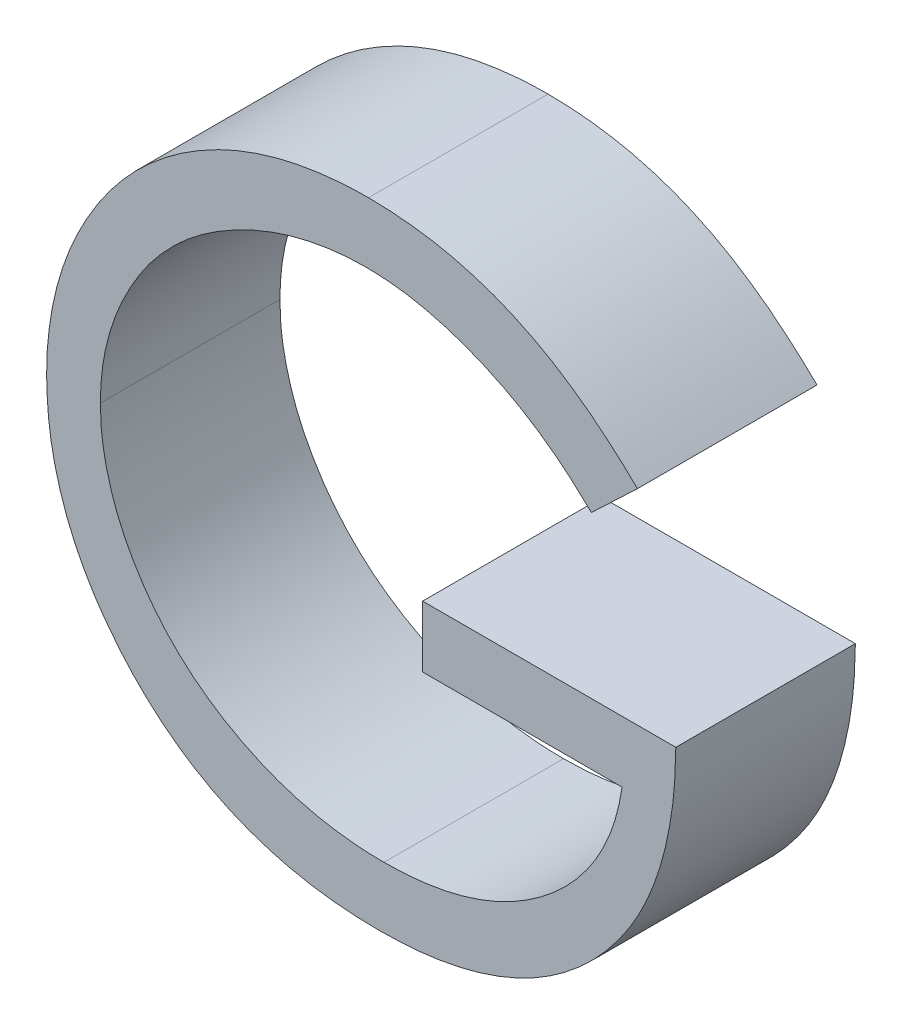
ISO-10303-21;
HEADER;
FILE_DESCRIPTION(('STEP AP214'),'2;1');
FILE_NAME('part.step','',(''),(''),'','','');
FILE_SCHEMA(('AUTOMOTIVE_DESIGN { 1 0 10303 214 1 1 1 1 }'));
ENDSEC;
DATA;
#1=APPLICATION_CONTEXT('core data for automotive mechanical design processes');
#2=APPLICATION_PROTOCOL_DEFINITION('international standard','automotive_design',2000,#1);
#3=PRODUCT_CONTEXT('',#1,'mechanical');
#4=PRODUCT('Part','Part','',(#3));
#5=PRODUCT_RELATED_PRODUCT_CATEGORY('part','',(#4));
#6=PRODUCT_DEFINITION_FORMATION('','',#4);
#7=PRODUCT_DEFINITION_CONTEXT('part definition',#1,'design');
#8=PRODUCT_DEFINITION('design','',#6,#7);
#9=PRODUCT_DEFINITION_SHAPE('','',#8);
#10=(LENGTH_UNIT() NAMED_UNIT(*) SI_UNIT(.MILLI.,.METRE.));
#11=(NAMED_UNIT(*) PLANE_ANGLE_UNIT() SI_UNIT($,.RADIAN.));
#12=(NAMED_UNIT(*) SI_UNIT($,.STERADIAN.) SOLID_ANGLE_UNIT());
#13=UNCERTAINTY_MEASURE_WITH_UNIT(LENGTH_MEASURE(1.E-05),#10,'distance_accuracy_value','');
#14=(GEOMETRIC_REPRESENTATION_CONTEXT(3) GLOBAL_UNCERTAINTY_ASSIGNED_CONTEXT((#13)) GLOBAL_UNIT_ASSIGNED_CONTEXT((#10,
#11,#12)) REPRESENTATION_CONTEXT('',''));
#15=CARTESIAN_POINT('',(0.,0.,0.));
#16=DIRECTION('',(0.,0.,1.));
#17=DIRECTION('',(1.,0.,0.));
#18=AXIS2_PLACEMENT_3D('',#15,#16,#17);
#19=CARTESIAN_POINT('',(-52.9995726976644,-17.7419139480257,1.5));
#20=CARTESIAN_POINT('',(-52.947803778146,-17.7427417933741,1.5));
#21=CARTESIAN_POINT('',(-52.8451520942351,-17.7443833134178,1.5));
#22=CARTESIAN_POINT('',(-52.692401048078,-17.7557613820899,1.5));
#23=CARTESIAN_POINT('',(-52.5420110271574,-17.7737954979667,1.5));
#24=CARTESIAN_POINT('',(-52.3937590416175,-17.7984051931004,1.5));
#25=CARTESIAN_POINT('',(-52.2481499470088,-17.8319247509659,1.5));
#26=CARTESIAN_POINT('',(-52.1047689392605,-17.8720365861798,1.5));
#27=CARTESIAN_POINT('',(-51.9634081731927,-17.9187391898525,1.5));
#28=CARTESIAN_POINT('',(-51.8245106743858,-17.9744375417672,1.5));
#29=CARTESIAN_POINT('',(-51.6871425086269,-18.0376570059468,1.5));
#30=CARTESIAN_POINT('',(-51.5505398793788,-18.1088190379541,1.5));
#31=CARTESIAN_POINT('',(-51.4151695279825,-18.1891404731405,1.5));
#32=CARTESIAN_POINT('',(-51.2807966973733,-18.2788598096078,1.5));
#33=CARTESIAN_POINT('',(-51.1465740432077,-18.376436120826,1.5));
#34=CARTESIAN_POINT('',(-51.0146245541307,-18.4846601546064,1.5));
#35=CARTESIAN_POINT('',(-50.8817632052066,-18.5992640915342,1.5));
#36=CARTESIAN_POINT('',(-50.7963320420432,-18.6816672113976,1.5));
#37=CARTESIAN_POINT('',(-50.7529781463824,-18.7234844608462,1.5));
#38=B_SPLINE_CURVE_WITH_KNOTS('',3,(#19,#20,#21,#22,#23,#24,#25,#26,#27,#28,#29,#30,#31,#32,#33,
#34,#35,#36,#37),.UNSPECIFIED.,.F.,.F.,(4,1,1,1,1,1,1,1,1,1,1,1,1,1,1,1,4),(0.,
0.0616169448204958,0.122179160819154,0.182216270448317,0.241864128661119,0.300960055602617,
0.35996906787339,0.419032918137867,0.478068687013021,0.537992581073218,0.598960230329196,
0.661321078882261,0.725247568886691,0.791220154152247,0.858745971844813,0.928317581412213,1.),.UNSPECIFIED.);
#39=DIRECTION('',(0.,0.,-1.));
#40=VECTOR('',#39,1.);
#41=SURFACE_OF_LINEAR_EXTRUSION('',#38,#40);
#42=CARTESIAN_POINT('',(-52.9995726976644,-17.7419139480257,0.));
#43=CARTESIAN_POINT('',(-52.947803778146,-17.7427417933741,0.));
#44=CARTESIAN_POINT('',(-52.8451520942351,-17.7443833134178,0.));
#45=CARTESIAN_POINT('',(-52.692401048078,-17.7557613820899,0.));
#46=CARTESIAN_POINT('',(-52.5420110271574,-17.7737954979667,0.));
#47=CARTESIAN_POINT('',(-52.3937590416175,-17.7984051931004,0.));
#48=CARTESIAN_POINT('',(-52.2481499470088,-17.8319247509659,0.));
#49=CARTESIAN_POINT('',(-52.1047689392605,-17.8720365861798,0.));
#50=CARTESIAN_POINT('',(-51.9634081731927,-17.9187391898525,0.));
#51=CARTESIAN_POINT('',(-51.8245106743858,-17.9744375417672,0.));
#52=CARTESIAN_POINT('',(-51.6871425086269,-18.0376570059468,0.));
#53=CARTESIAN_POINT('',(-51.5505398793788,-18.1088190379541,0.));
#54=CARTESIAN_POINT('',(-51.4151695279825,-18.1891404731405,0.));
#55=CARTESIAN_POINT('',(-51.2807966973733,-18.2788598096078,0.));
#56=CARTESIAN_POINT('',(-51.1465740432077,-18.376436120826,0.));
#57=CARTESIAN_POINT('',(-51.0146245541307,-18.4846601546064,0.));
#58=CARTESIAN_POINT('',(-50.8817632052066,-18.5992640915342,0.));
#59=CARTESIAN_POINT('',(-50.7963320420432,-18.6816672113976,0.));
#60=CARTESIAN_POINT('',(-50.7529781463824,-18.7234844608462,0.));
#61=B_SPLINE_CURVE_WITH_KNOTS('',3,(#42,#43,#44,#45,#46,#47,#48,#49,#50,#51,#52,#53,#54,#55,#56,
#57,#58,#59,#60),.UNSPECIFIED.,.F.,.F.,(4,1,1,1,1,1,1,1,1,1,1,1,1,1,1,1,4),(0.,
0.0616169448204958,0.122179160819154,0.182216270448317,0.241864128661119,0.300960055602617,
0.35996906787339,0.419032918137867,0.478068687013021,0.537992581073218,0.598960230329196,
0.661321078882261,0.725247568886691,0.791220154152247,0.858745971844813,0.928317581412213,1.),.UNSPECIFIED.);
#62=CARTESIAN_POINT('',(-52.9995726976644,-17.7419139480257,0.));
#63=VERTEX_POINT('',#62);
#64=CARTESIAN_POINT('',(-50.7529781463824,-18.7234844608462,0.));
#65=VERTEX_POINT('',#64);
#66=EDGE_CURVE('E251',#63,#65,#61,.T.);
#67=ORIENTED_EDGE('',*,*,#66,.F.);
#68=DIRECTION('',(0.,0.,-1.));
#69=VECTOR('',#68,1.);
#70=CARTESIAN_POINT('',(-52.9995726976644,-17.7419139480257,1.5));
#71=LINE('',#70,#69);
#72=CARTESIAN_POINT('',(-52.9995726976644,-17.7419139480257,1.5));
#73=VERTEX_POINT('',#72);
#74=EDGE_CURVE('E11',#73,#63,#71,.T.);
#75=ORIENTED_EDGE('',*,*,#74,.F.);
#76=CARTESIAN_POINT('',(-50.7529781463824,-18.7234844608462,1.5));
#77=VERTEX_POINT('',#76);
#78=EDGE_CURVE('E279',#73,#77,#38,.T.);
#79=ORIENTED_EDGE('',*,*,#78,.T.);
#80=DIRECTION('',(0.,0.,-1.));
#81=VECTOR('',#80,1.);
#82=CARTESIAN_POINT('',(-50.7529781463824,-18.7234844608462,1.5));
#83=LINE('',#82,#81);
#84=EDGE_CURVE('E37',#77,#65,#83,.T.);
#85=ORIENTED_EDGE('',*,*,#84,.T.);
#86=EDGE_LOOP('',(#67,#75,#79,#85));
#87=FACE_BOUND('',#86,.T.);
#88=ADVANCED_FACE('F33',(#87),#41,.T.);
#89=CARTESIAN_POINT('',(-55.6888755822798,-20.3681158711026,1.5));
#90=CARTESIAN_POINT('',(-55.6881152420844,-20.3093069386906,1.5));
#91=CARTESIAN_POINT('',(-55.6866042251531,-20.1924364994753,1.5));
#92=CARTESIAN_POINT('',(-55.6682820591942,-20.0189260602507,1.5));
#93=CARTESIAN_POINT('',(-55.6419943192026,-19.8484965000175,1.5));
#94=CARTESIAN_POINT('',(-55.6033556697908,-19.6812871339121,1.5));
#95=CARTESIAN_POINT('',(-55.5546467201972,-19.5171862885382,1.5));
#96=CARTESIAN_POINT('',(-55.4938560258866,-19.3561177687274,1.5));
#97=CARTESIAN_POINT('',(-55.423077603092,-19.1979865235677,1.5));
#98=CARTESIAN_POINT('',(-55.3408126085724,-19.0438809978618,1.5));
#99=CARTESIAN_POINT('',(-55.249263380756,-18.8958461224563,1.5));
#100=CARTESIAN_POINT('',(-55.1499059231459,-18.7544778319306,1.5));
#101=CARTESIAN_POINT('',(-55.0413293513807,-18.6223505962421,1.5));
#102=CARTESIAN_POINT('',(-54.9253067806239,-18.4977910987295,1.5));
#103=CARTESIAN_POINT('',(-54.8004539374581,-18.3823641744638,1.5));
#104=CARTESIAN_POINT('',(-54.6679404750759,-18.275001159205,1.5));
#105=CARTESIAN_POINT('',(-54.5276642709644,-18.1755580366291,1.5));
#106=CARTESIAN_POINT('',(-54.379184013834,-18.0856011298524,1.5));
#107=CARTESIAN_POINT('',(-54.2247158932105,-18.0047959577563,1.5));
#108=CARTESIAN_POINT('',(-54.064630176858,-17.9339542267268,1.5));
#109=CARTESIAN_POINT('',(-53.8989757327054,-17.875406633204,1.5));
#110=CARTESIAN_POINT('',(-53.7289936218054,-17.8257298051632,1.5));
#111=CARTESIAN_POINT('',(-53.5533971923139,-17.7889938900327,1.5));
#112=CARTESIAN_POINT('',(-53.3734607110586,-17.7623528251969,1.5));
#113=CARTESIAN_POINT('',(-53.1882462653195,-17.7441233971108,1.5));
#114=CARTESIAN_POINT('',(-53.0630519377104,-17.7426573173836,1.5));
#115=CARTESIAN_POINT('',(-52.9995726976644,-17.7419139480257,1.5));
#116=B_SPLINE_CURVE_WITH_KNOTS('',3,(#89,#90,#91,#92,#93,#94,#95,#96,#97,#98,#99,#100,#101,#102,
#103,#104,#105,#106,#107,#108,#109,#110,#111,#112,#113,#114,#115),.UNSPECIFIED.,.F.,.F.,(4,1,1,
1,1,1,1,1,1,1,1,1,1,1,1,1,1,1,1,1,1,1,1,1,4),(0.,0.042039379701216,0.083544464565361,
0.124643056673449,0.165303063451956,0.206170747136531,0.246970719928893,0.288329266023863,
0.329986532825205,0.371797472895551,0.412737629424681,0.453459280518726,0.494001342419668,
0.534380667601164,0.574951545297472,0.615891701826603,0.657249558721596,0.69900660682437,
0.740486273750268,0.782325155707546,0.824567455462729,0.867041243730895,0.910499531482223,
0.954619176173828,1.),.UNSPECIFIED.);
#117=DIRECTION('',(0.,0.,-1.));
#118=VECTOR('',#117,1.);
#119=SURFACE_OF_LINEAR_EXTRUSION('',#116,#118);
#120=CARTESIAN_POINT('',(-55.6888755822798,-20.3681158711026,0.));
#121=CARTESIAN_POINT('',(-55.6881152420844,-20.3093069386906,0.));
#122=CARTESIAN_POINT('',(-55.6866042251531,-20.1924364994753,0.));
#123=CARTESIAN_POINT('',(-55.6682820591942,-20.0189260602507,0.));
#124=CARTESIAN_POINT('',(-55.6419943192026,-19.8484965000175,0.));
#125=CARTESIAN_POINT('',(-55.6033556697908,-19.6812871339121,0.));
#126=CARTESIAN_POINT('',(-55.5546467201972,-19.5171862885382,0.));
#127=CARTESIAN_POINT('',(-55.4938560258866,-19.3561177687274,0.));
#128=CARTESIAN_POINT('',(-55.423077603092,-19.1979865235677,0.));
#129=CARTESIAN_POINT('',(-55.3408126085724,-19.0438809978618,0.));
#130=CARTESIAN_POINT('',(-55.249263380756,-18.8958461224563,0.));
#131=CARTESIAN_POINT('',(-55.1499059231459,-18.7544778319306,0.));
#132=CARTESIAN_POINT('',(-55.0413293513807,-18.6223505962421,0.));
#133=CARTESIAN_POINT('',(-54.9253067806239,-18.4977910987295,0.));
#134=CARTESIAN_POINT('',(-54.8004539374581,-18.3823641744638,0.));
#135=CARTESIAN_POINT('',(-54.6679404750759,-18.275001159205,0.));
#136=CARTESIAN_POINT('',(-54.5276642709644,-18.1755580366291,0.));
#137=CARTESIAN_POINT('',(-54.379184013834,-18.0856011298524,0.));
#138=CARTESIAN_POINT('',(-54.2247158932105,-18.0047959577563,0.));
#139=CARTESIAN_POINT('',(-54.064630176858,-17.9339542267268,0.));
#140=CARTESIAN_POINT('',(-53.8989757327054,-17.875406633204,0.));
#141=CARTESIAN_POINT('',(-53.7289936218054,-17.8257298051632,0.));
#142=CARTESIAN_POINT('',(-53.5533971923139,-17.7889938900327,0.));
#143=CARTESIAN_POINT('',(-53.3734607110586,-17.7623528251969,0.));
#144=CARTESIAN_POINT('',(-53.1882462653195,-17.7441233971108,0.));
#145=CARTESIAN_POINT('',(-53.0630519377104,-17.7426573173836,0.));
#146=CARTESIAN_POINT('',(-52.9995726976644,-17.7419139480257,0.));
#147=B_SPLINE_CURVE_WITH_KNOTS('',3,(#120,#121,#122,#123,#124,#125,#126,#127,#128,#129,#130,
#131,#132,#133,#134,#135,#136,#137,#138,#139,#140,#141,#142,#143,#144,#145,#146),.UNSPECIFIED.,
.F.,.F.,(4,1,1,1,1,1,1,1,1,1,1,1,1,1,1,1,1,1,1,1,1,1,1,1,4),(0.,0.042039379701216,
0.083544464565361,0.124643056673449,0.165303063451956,0.206170747136531,0.246970719928893,
0.288329266023863,0.329986532825205,0.371797472895551,0.412737629424681,0.453459280518726,
0.494001342419668,0.534380667601164,0.574951545297472,0.615891701826603,0.657249558721596,
0.69900660682437,0.740486273750268,0.782325155707546,0.824567455462729,0.867041243730895,
0.910499531482223,0.954619176173828,1.),.UNSPECIFIED.);
#148=CARTESIAN_POINT('',(-55.6888755822798,-20.3681158711026,0.));
#149=VERTEX_POINT('',#148);
#150=EDGE_CURVE('E278',#149,#63,#147,.T.);
#151=ORIENTED_EDGE('',*,*,#150,.F.);
#152=DIRECTION('',(0.,0.,-1.));
#153=VECTOR('',#152,1.);
#154=CARTESIAN_POINT('',(-55.6888755822798,-20.3681158711026,1.5));
#155=LINE('',#154,#153);
#156=CARTESIAN_POINT('',(-55.6888755822798,-20.3681158711026,1.5));
#157=VERTEX_POINT('',#156);
#158=EDGE_CURVE('E43',#157,#149,#155,.T.);
#159=ORIENTED_EDGE('',*,*,#158,.F.);
#160=EDGE_CURVE('E151',#157,#73,#116,.T.);
#161=ORIENTED_EDGE('',*,*,#160,.T.);
#162=ORIENTED_EDGE('',*,*,#74,.T.);
#163=EDGE_LOOP('',(#151,#159,#161,#162));
#164=FACE_BOUND('',#163,.T.);
#165=ADVANCED_FACE('F258',(#164),#119,.T.);
#166=CARTESIAN_POINT('',(-55.075894813049,-22.0528113839231,1.5));
#167=CARTESIAN_POINT('',(-55.1247318586714,-21.991853308194,1.5));
#168=CARTESIAN_POINT('',(-55.2215953052945,-21.8709489979642,1.5));
#169=CARTESIAN_POINT('',(-55.3462783861792,-21.6772347916379,1.5));
#170=CARTESIAN_POINT('',(-55.4525661045088,-21.4766607056815,1.5));
#171=CARTESIAN_POINT('',(-55.5388058504164,-21.2686683794568,1.5));
#172=CARTESIAN_POINT('',(-55.6061459737623,-21.0534523611051,1.5));
#173=CARTESIAN_POINT('',(-55.6544406205444,-20.8312876593515,1.5));
#174=CARTESIAN_POINT('',(-55.6827367479569,-20.6018881871548,1.5));
#175=CARTESIAN_POINT('',(-55.6868132300149,-20.4466520947743,1.5));
#176=CARTESIAN_POINT('',(-55.6888755822798,-20.3681158711026,1.5));
#177=B_SPLINE_CURVE_WITH_KNOTS('',3,(#166,#167,#168,#169,#170,#171,#172,#173,#174,#175,#176),
.UNSPECIFIED.,.F.,.F.,(4,1,1,1,1,1,1,1,4),(0.,0.127895677373537,0.253668418322868,
0.37673843220701,0.499344472746072,0.62199930685608,0.745698547513127,0.871345152752213,1.),.UNSPECIFIED.);
#178=DIRECTION('',(0.,0.,-1.));
#179=VECTOR('',#178,1.);
#180=SURFACE_OF_LINEAR_EXTRUSION('',#177,#179);
#181=CARTESIAN_POINT('',(-55.075894813049,-22.0528113839231,0.));
#182=CARTESIAN_POINT('',(-55.1247318586714,-21.991853308194,0.));
#183=CARTESIAN_POINT('',(-55.2215953052945,-21.8709489979642,0.));
#184=CARTESIAN_POINT('',(-55.3462783861792,-21.6772347916379,0.));
#185=CARTESIAN_POINT('',(-55.4525661045088,-21.4766607056815,0.));
#186=CARTESIAN_POINT('',(-55.5388058504164,-21.2686683794568,0.));
#187=CARTESIAN_POINT('',(-55.6061459737623,-21.0534523611051,0.));
#188=CARTESIAN_POINT('',(-55.6544406205444,-20.8312876593515,0.));
#189=CARTESIAN_POINT('',(-55.6827367479569,-20.6018881871548,0.));
#190=CARTESIAN_POINT('',(-55.6868132300149,-20.4466520947743,0.));
#191=CARTESIAN_POINT('',(-55.6888755822798,-20.3681158711026,0.));
#192=B_SPLINE_CURVE_WITH_KNOTS('',3,(#181,#182,#183,#184,#185,#186,#187,#188,#189,#190,#191),
.UNSPECIFIED.,.F.,.F.,(4,1,1,1,1,1,1,1,4),(0.,0.127895677373537,0.253668418322868,
0.37673843220701,0.499344472746072,0.62199930685608,0.745698547513127,0.871345152752213,1.),.UNSPECIFIED.);
#193=CARTESIAN_POINT('',(-55.075894813049,-22.0528113839231,0.));
#194=VERTEX_POINT('',#193);
#195=EDGE_CURVE('E138',#194,#149,#192,.T.);
#196=ORIENTED_EDGE('',*,*,#195,.F.);
#197=DIRECTION('',(0.,0.,-1.));
#198=VECTOR('',#197,1.);
#199=CARTESIAN_POINT('',(-55.075894813049,-22.0528113839231,1.5));
#200=LINE('',#199,#198);
#201=CARTESIAN_POINT('',(-55.075894813049,-22.0528113839231,1.5));
#202=VERTEX_POINT('',#201);
#203=EDGE_CURVE('E133',#202,#194,#200,.T.);
#204=ORIENTED_EDGE('',*,*,#203,.F.);
#205=EDGE_CURVE('E136',#202,#157,#177,.T.);
#206=ORIENTED_EDGE('',*,*,#205,.T.);
#207=ORIENTED_EDGE('',*,*,#158,.T.);
#208=EDGE_LOOP('',(#196,#204,#206,#207));
#209=FACE_BOUND('',#208,.T.);
#210=ADVANCED_FACE('F135',(#209),#180,.T.);
#211=CARTESIAN_POINT('',(-52.9094284668952,-22.998324204436,1.5));
#212=CARTESIAN_POINT('',(-52.9658715174151,-22.9975111741045,1.5));
#213=CARTESIAN_POINT('',(-53.0771954043408,-22.9959076162554,1.5));
#214=CARTESIAN_POINT('',(-53.241611015874,-22.9845114056425,1.5));
#215=CARTESIAN_POINT('',(-53.4014933309849,-22.9669677252186,1.5));
#216=CARTESIAN_POINT('',(-53.5568190579705,-22.9404746916795,1.5));
#217=CARTESIAN_POINT('',(-53.7081595467973,-22.9080251857403,1.5));
#218=CARTESIAN_POINT('',(-53.8547589538301,-22.8664727303408,1.5));
#219=CARTESIAN_POINT('',(-53.9971757281841,-22.8183745884155,1.5));
#220=CARTESIAN_POINT('',(-54.1356299933868,-22.7636664834536,1.5));
#221=CARTESIAN_POINT('',(-54.2688650602191,-22.7002784024985,1.5));
#222=CARTESIAN_POINT('',(-54.3974743701793,-22.6298360603729,1.5));
#223=CARTESIAN_POINT('',(-54.5221688355158,-22.5527026878763,1.5));
#224=CARTESIAN_POINT('',(-54.6420990711952,-22.4675443368404,1.5));
#225=CARTESIAN_POINT('',(-54.7578899590172,-22.3749979651688,1.5));
#226=CARTESIAN_POINT('',(-54.8687948784534,-22.274878080912,1.5));
#227=CARTESIAN_POINT('',(-54.975434704264,-22.1674907669976,1.5));
#228=CARTESIAN_POINT('',(-55.0422353664657,-22.0912350389986,1.5));
#229=CARTESIAN_POINT('',(-55.075894813049,-22.0528113839231,1.5));
#230=B_SPLINE_CURVE_WITH_KNOTS('',3,(#211,#212,#213,#214,#215,#216,#217,#218,#219,#220,#221,
#222,#223,#224,#225,#226,#227,#228,#229),.UNSPECIFIED.,.F.,.F.,(4,1,1,1,1,1,1,1,1,1,1,1,1,1,1,1,
4),(0.,0.0692365237083653,0.136556739323003,0.202094157267331,0.266464260366059,
0.329768822872775,0.391878965921428,0.453270593103038,0.514114664070464,0.574389510365487,
0.634141663851328,0.693923287499325,0.754152196307388,0.814470164130036,0.875660630131174,
0.937348010628002,1.),.UNSPECIFIED.);
#231=DIRECTION('',(0.,0.,-1.));
#232=VECTOR('',#231,1.);
#233=SURFACE_OF_LINEAR_EXTRUSION('',#230,#232);
#234=CARTESIAN_POINT('',(-52.9094284668952,-22.998324204436,0.));
#235=CARTESIAN_POINT('',(-52.9658715174151,-22.9975111741045,0.));
#236=CARTESIAN_POINT('',(-53.0771954043408,-22.9959076162554,0.));
#237=CARTESIAN_POINT('',(-53.241611015874,-22.9845114056425,0.));
#238=CARTESIAN_POINT('',(-53.4014933309849,-22.9669677252186,0.));
#239=CARTESIAN_POINT('',(-53.5568190579705,-22.9404746916795,0.));
#240=CARTESIAN_POINT('',(-53.7081595467973,-22.9080251857403,0.));
#241=CARTESIAN_POINT('',(-53.8547589538301,-22.8664727303408,0.));
#242=CARTESIAN_POINT('',(-53.9971757281841,-22.8183745884155,0.));
#243=CARTESIAN_POINT('',(-54.1356299933868,-22.7636664834536,0.));
#244=CARTESIAN_POINT('',(-54.2688650602191,-22.7002784024985,0.));
#245=CARTESIAN_POINT('',(-54.3974743701793,-22.6298360603729,0.));
#246=CARTESIAN_POINT('',(-54.5221688355158,-22.5527026878763,0.));
#247=CARTESIAN_POINT('',(-54.6420990711952,-22.4675443368404,0.));
#248=CARTESIAN_POINT('',(-54.7578899590172,-22.3749979651688,0.));
#249=CARTESIAN_POINT('',(-54.8687948784534,-22.274878080912,0.));
#250=CARTESIAN_POINT('',(-54.975434704264,-22.1674907669976,0.));
#251=CARTESIAN_POINT('',(-55.0422353664657,-22.0912350389986,0.));
#252=CARTESIAN_POINT('',(-55.075894813049,-22.0528113839231,0.));
#253=B_SPLINE_CURVE_WITH_KNOTS('',3,(#234,#235,#236,#237,#238,#239,#240,#241,#242,#243,#244,
#245,#246,#247,#248,#249,#250,#251,#252),.UNSPECIFIED.,.F.,.F.,(4,1,1,1,1,1,1,1,1,1,1,1,1,1,1,1,
4),(0.,0.0692365237083653,0.136556739323003,0.202094157267331,0.266464260366059,
0.329768822872775,0.391878965921428,0.453270593103038,0.514114664070464,0.574389510365487,
0.634141663851328,0.693923287499325,0.754152196307388,0.814470164130036,0.875660630131174,
0.937348010628002,1.),.UNSPECIFIED.);
#254=CARTESIAN_POINT('',(-52.9094284668952,-22.998324204436,0.));
#255=VERTEX_POINT('',#254);
#256=EDGE_CURVE('E282',#255,#194,#253,.T.);
#257=ORIENTED_EDGE('',*,*,#256,.F.);
#258=DIRECTION('',(0.,0.,-1.));
#259=VECTOR('',#258,1.);
#260=CARTESIAN_POINT('',(-52.9094284668952,-22.998324204436,1.5));
#261=LINE('',#260,#259);
#262=CARTESIAN_POINT('',(-52.9094284668952,-22.998324204436,1.5));
#263=VERTEX_POINT('',#262);
#264=EDGE_CURVE('E143',#263,#255,#261,.T.);
#265=ORIENTED_EDGE('',*,*,#264,.F.);
#266=EDGE_CURVE('E149',#263,#202,#230,.T.);
#267=ORIENTED_EDGE('',*,*,#266,.T.);
#268=ORIENTED_EDGE('',*,*,#203,.T.);
#269=EDGE_LOOP('',(#257,#265,#267,#268));
#270=FACE_BOUND('',#269,.T.);
#271=ADVANCED_FACE('F153',(#270),#233,.T.);
#272=CARTESIAN_POINT('',(-50.4324653258695,-20.4342216403334,1.5));
#273=CARTESIAN_POINT('',(-50.4349022521252,-20.5298037672203,1.5));
#274=CARTESIAN_POINT('',(-50.4396717570127,-20.7168752554473,1.5));
#275=CARTESIAN_POINT('',(-50.4731273508041,-20.9896899280682,1.5));
#276=CARTESIAN_POINT('',(-50.527150939756,-21.2473637756567,1.5));
#277=CARTESIAN_POINT('',(-50.6009513852735,-21.4901681637499,1.5));
#278=CARTESIAN_POINT('',(-50.6964874999903,-21.7177590105443,1.5));
#279=CARTESIAN_POINT('',(-50.812733969204,-21.9303673907462,1.5));
#280=CARTESIAN_POINT('',(-50.9515512850131,-22.1266197919846,1.5));
#281=CARTESIAN_POINT('',(-51.107994772884,-22.3081183685738,1.5));
#282=CARTESIAN_POINT('',(-51.2835661411497,-22.4700172431066,1.5));
#283=CARTESIAN_POINT('',(-51.4735213125462,-22.6123114401714,1.5));
#284=CARTESIAN_POINT('',(-51.6781741244784,-22.7321723192345,1.5));
#285=CARTESIAN_POINT('',(-51.8973309923206,-22.8296875512401,1.5));
#286=CARTESIAN_POINT('',(-52.1302744686621,-22.9057932582613,1.5));
#287=CARTESIAN_POINT('',(-52.3775435826328,-22.9597526535235,1.5));
#288=CARTESIAN_POINT('',(-52.6388030121816,-22.9920811725912,1.5));
#289=CARTESIAN_POINT('',(-52.8178554077379,-22.9962117145926,1.5));
#290=CARTESIAN_POINT('',(-52.9094284668952,-22.998324204436,1.5));
#291=B_SPLINE_CURVE_WITH_KNOTS('',3,(#272,#273,#274,#275,#276,#277,#278,#279,#280,#281,#282,
#283,#284,#285,#286,#287,#288,#289,#290),.UNSPECIFIED.,.F.,.F.,(4,1,1,1,1,1,1,1,1,1,1,1,1,1,1,1,
4),(0.,0.071272277891841,0.139492722424175,0.204635418715339,0.267405740386264,
0.328445597526984,0.388397163141541,0.447733931258266,0.507391621231218,0.566767555363434,
0.625478337516419,0.684066505918798,0.743248445815342,0.804033357398258,0.866498750699673,
0.93172323798416,1.),.UNSPECIFIED.);
#292=DIRECTION('',(0.,0.,-1.));
#293=VECTOR('',#292,1.);
#294=SURFACE_OF_LINEAR_EXTRUSION('',#291,#293);
#295=CARTESIAN_POINT('',(-50.4324653258695,-20.4342216403334,0.));
#296=CARTESIAN_POINT('',(-50.4349022521252,-20.5298037672203,0.));
#297=CARTESIAN_POINT('',(-50.4396717570127,-20.7168752554473,0.));
#298=CARTESIAN_POINT('',(-50.4731273508041,-20.9896899280682,0.));
#299=CARTESIAN_POINT('',(-50.527150939756,-21.2473637756567,0.));
#300=CARTESIAN_POINT('',(-50.6009513852735,-21.4901681637499,0.));
#301=CARTESIAN_POINT('',(-50.6964874999903,-21.7177590105443,0.));
#302=CARTESIAN_POINT('',(-50.812733969204,-21.9303673907462,0.));
#303=CARTESIAN_POINT('',(-50.9515512850131,-22.1266197919846,0.));
#304=CARTESIAN_POINT('',(-51.107994772884,-22.3081183685738,0.));
#305=CARTESIAN_POINT('',(-51.2835661411497,-22.4700172431066,0.));
#306=CARTESIAN_POINT('',(-51.4735213125462,-22.6123114401714,0.));
#307=CARTESIAN_POINT('',(-51.6781741244784,-22.7321723192345,0.));
#308=CARTESIAN_POINT('',(-51.8973309923206,-22.8296875512401,0.));
#309=CARTESIAN_POINT('',(-52.1302744686621,-22.9057932582613,0.));
#310=CARTESIAN_POINT('',(-52.3775435826328,-22.9597526535235,0.));
#311=CARTESIAN_POINT('',(-52.6388030121816,-22.9920811725912,0.));
#312=CARTESIAN_POINT('',(-52.8178554077379,-22.9962117145926,0.));
#313=CARTESIAN_POINT('',(-52.9094284668952,-22.998324204436,0.));
#314=B_SPLINE_CURVE_WITH_KNOTS('',3,(#295,#296,#297,#298,#299,#300,#301,#302,#303,#304,#305,
#306,#307,#308,#309,#310,#311,#312,#313),.UNSPECIFIED.,.F.,.F.,(4,1,1,1,1,1,1,1,1,1,1,1,1,1,1,1,
4),(0.,0.071272277891841,0.139492722424175,0.204635418715339,0.267405740386264,
0.328445597526984,0.388397163141541,0.447733931258266,0.507391621231218,0.566767555363434,
0.625478337516419,0.684066505918798,0.743248445815342,0.804033357398258,0.866498750699673,
0.93172323798416,1.),.UNSPECIFIED.);
#315=CARTESIAN_POINT('',(-50.4324653258695,-20.4342216403334,0.));
#316=VERTEX_POINT('',#315);
#317=EDGE_CURVE('E295',#316,#255,#314,.T.);
#318=ORIENTED_EDGE('',*,*,#317,.F.);
#319=DIRECTION('',(0.,0.,-1.));
#320=VECTOR('',#319,1.);
#321=CARTESIAN_POINT('',(-50.4324653258695,-20.4342216403334,1.5));
#322=LINE('',#321,#320);
#323=CARTESIAN_POINT('',(-50.4324653258695,-20.4342216403334,1.5));
#324=VERTEX_POINT('',#323);
#325=EDGE_CURVE('E223',#324,#316,#322,.T.);
#326=ORIENTED_EDGE('',*,*,#325,.F.);
#327=EDGE_CURVE('E154',#324,#263,#291,.T.);
#328=ORIENTED_EDGE('',*,*,#327,.T.);
#329=ORIENTED_EDGE('',*,*,#264,.T.);
#330=EDGE_LOOP('',(#318,#326,#328,#329));
#331=FACE_BOUND('',#330,.T.);
#332=ADVANCED_FACE('F176',(#331),#294,.T.);
#333=CARTESIAN_POINT('',(-52.5478499412541,-20.4342216403334,1.5));
#334=DIRECTION('',(0.,1.,0.));
#335=DIRECTION('',(0.,0.,1.));
#336=AXIS2_PLACEMENT_3D('',#333,#334,#335);
#337=PLANE('',#336);
#338=DIRECTION('',(1.,0.,0.));
#339=VECTOR('',#338,1.);
#340=CARTESIAN_POINT('',(-52.5478499412541,-20.4342216403334,0.));
#341=LINE('',#340,#339);
#342=CARTESIAN_POINT('',(-52.5478499412541,-20.4342216403334,0.));
#343=VERTEX_POINT('',#342);
#344=EDGE_CURVE('E297',#343,#316,#341,.T.);
#345=ORIENTED_EDGE('',*,*,#344,.F.);
#346=DIRECTION('',(0.,0.,-1.));
#347=VECTOR('',#346,1.);
#348=CARTESIAN_POINT('',(-52.5478499412541,-20.4342216403334,1.5));
#349=LINE('',#348,#347);
#350=CARTESIAN_POINT('',(-52.5478499412541,-20.4342216403334,1.5));
#351=VERTEX_POINT('',#350);
#352=EDGE_CURVE('E225',#351,#343,#349,.T.);
#353=ORIENTED_EDGE('',*,*,#352,.F.);
#354=DIRECTION('',(1.,0.,0.));
#355=VECTOR('',#354,1.);
#356=CARTESIAN_POINT('',(-52.5478499412541,-20.4342216403334,1.5));
#357=LINE('',#356,#355);
#358=EDGE_CURVE('E156',#351,#324,#357,.T.);
#359=ORIENTED_EDGE('',*,*,#358,.T.);
#360=ORIENTED_EDGE('',*,*,#325,.T.);
#361=EDGE_LOOP('',(#345,#353,#359,#360));
#362=FACE_BOUND('',#361,.T.);
#363=ADVANCED_FACE('F180',(#362),#337,.T.);
#364=CARTESIAN_POINT('',(-52.5478499412541,-20.9470421531539,1.5));
#365=DIRECTION('',(-1.,0.,0.));
#366=DIRECTION('',(0.,0.,1.));
#367=AXIS2_PLACEMENT_3D('',#364,#365,#366);
#368=PLANE('',#367);
#369=DIRECTION('',(0.,1.,0.));
#370=VECTOR('',#369,1.);
#371=CARTESIAN_POINT('',(-52.5478499412541,-20.9470421531539,0.));
#372=LINE('',#371,#370);
#373=CARTESIAN_POINT('',(-52.5478499412541,-20.9470421531539,0.));
#374=VERTEX_POINT('',#373);
#375=EDGE_CURVE('E231',#374,#343,#372,.T.);
#376=ORIENTED_EDGE('',*,*,#375,.F.);
#377=DIRECTION('',(0.,0.,-1.));
#378=VECTOR('',#377,1.);
#379=CARTESIAN_POINT('',(-52.5478499412541,-20.9470421531539,1.5));
#380=LINE('',#379,#378);
#381=CARTESIAN_POINT('',(-52.5478499412541,-20.9470421531539,1.5));
#382=VERTEX_POINT('',#381);
#383=EDGE_CURVE('E229',#382,#374,#380,.T.);
#384=ORIENTED_EDGE('',*,*,#383,.F.);
#385=DIRECTION('',(0.,1.,0.));
#386=VECTOR('',#385,1.);
#387=CARTESIAN_POINT('',(-52.5478499412541,-20.9470421531539,1.5));
#388=LINE('',#387,#386);
#389=EDGE_CURVE('E218',#382,#351,#388,.T.);
#390=ORIENTED_EDGE('',*,*,#389,.T.);
#391=ORIENTED_EDGE('',*,*,#352,.T.);
#392=EDGE_LOOP('',(#376,#384,#390,#391));
#393=FACE_BOUND('',#392,.T.);
#394=ADVANCED_FACE('F184',(#393),#368,.T.);
#395=CARTESIAN_POINT('',(-50.8811832745875,-20.9470421531539,1.5));
#396=DIRECTION('',(0.,-1.,0.));
#397=DIRECTION('',(0.,0.,-1.));
#398=AXIS2_PLACEMENT_3D('',#395,#396,#397);
#399=PLANE('',#398);
#400=DIRECTION('',(-1.,0.,0.));
#401=VECTOR('',#400,1.);
#402=CARTESIAN_POINT('',(-50.8811832745875,-20.9470421531539,0.));
#403=LINE('',#402,#401);
#404=CARTESIAN_POINT('',(-50.8811832745875,-20.9470421531539,0.));
#405=VERTEX_POINT('',#404);
#406=EDGE_CURVE('E312',#405,#374,#403,.T.);
#407=ORIENTED_EDGE('',*,*,#406,.F.);
#408=DIRECTION('',(0.,0.,-1.));
#409=VECTOR('',#408,1.);
#410=CARTESIAN_POINT('',(-50.8811832745875,-20.9470421531539,1.5));
#411=LINE('',#410,#409);
#412=CARTESIAN_POINT('',(-50.8811832745875,-20.9470421531539,1.5));
#413=VERTEX_POINT('',#412);
#414=EDGE_CURVE('E234',#413,#405,#411,.T.);
#415=ORIENTED_EDGE('',*,*,#414,.F.);
#416=DIRECTION('',(-1.,0.,0.));
#417=VECTOR('',#416,1.);
#418=CARTESIAN_POINT('',(-50.8811832745875,-20.9470421531539,1.5));
#419=LINE('',#418,#417);
#420=EDGE_CURVE('E207',#413,#382,#419,.T.);
#421=ORIENTED_EDGE('',*,*,#420,.T.);
#422=ORIENTED_EDGE('',*,*,#383,.T.);
#423=EDGE_LOOP('',(#407,#415,#421,#422));
#424=FACE_BOUND('',#423,.T.);
#425=ADVANCED_FACE('F188',(#424),#399,.T.);
#426=CARTESIAN_POINT('',(-52.8703659668952,-22.4855036916154,1.5));
#427=CARTESIAN_POINT('',(-52.8055397565606,-22.4841485825968,1.5));
#428=CARTESIAN_POINT('',(-52.6782429604722,-22.4814876058787,1.5));
#429=CARTESIAN_POINT('',(-52.4911194708925,-22.4607729067525,1.5));
#430=CARTESIAN_POINT('',(-52.3114007984271,-22.4284203443786,1.5));
#431=CARTESIAN_POINT('',(-52.1395919366322,-22.3810404919703,1.5));
#432=CARTESIAN_POINT('',(-51.9754933356272,-22.3206066705458,1.5));
#433=CARTESIAN_POINT('',(-51.8185034194425,-22.2477561184499,1.5));
#434=CARTESIAN_POINT('',(-51.6698581927997,-22.1596946054818,1.5));
#435=CARTESIAN_POINT('',(-51.5291108020103,-22.0603033667881,1.5));
#436=CARTESIAN_POINT('',(-51.3994576798896,-21.9495678918075,1.5));
#437=CARTESIAN_POINT('',(-51.2825232169043,-21.8300758130144,1.5));
#438=CARTESIAN_POINT('',(-51.1801725180189,-21.7024071463646,1.5));
#439=CARTESIAN_POINT('',(-51.0908800905075,-21.567313838793,1.5));
#440=CARTESIAN_POINT('',(-51.0170105842745,-21.4236776887784,1.5));
#441=CARTESIAN_POINT('',(-50.956378019883,-21.2722025995548,1.5));
#442=CARTESIAN_POINT('',(-50.9099018889923,-21.1128204396458,1.5));
#443=CARTESIAN_POINT('',(-50.8908233535045,-21.0026895371811,1.5));
#444=CARTESIAN_POINT('',(-50.8811832745875,-20.9470421531539,1.5));
#445=B_SPLINE_CURVE_WITH_KNOTS('',3,(#426,#427,#428,#429,#430,#431,#432,#433,#434,#435,#436,
#437,#438,#439,#440,#441,#442,#443,#444),.UNSPECIFIED.,.F.,.F.,(4,1,1,1,1,1,1,1,1,1,1,1,1,1,1,1,
4),(0.,0.0706300675154722,0.138693612596303,0.204917714834701,0.269440883424697,
0.332636334647052,0.395301694499846,0.457763931471422,0.520657020425742,0.582851651887266,
0.643315197601048,0.702580231903014,0.760907538627683,0.819489612767475,0.878269075923359,
0.938491310536131,1.),.UNSPECIFIED.);
#446=DIRECTION('',(0.,0.,-1.));
#447=VECTOR('',#446,1.);
#448=SURFACE_OF_LINEAR_EXTRUSION('',#445,#447);
#449=CARTESIAN_POINT('',(-52.8703659668952,-22.4855036916154,0.));
#450=CARTESIAN_POINT('',(-52.8055397565606,-22.4841485825968,0.));
#451=CARTESIAN_POINT('',(-52.6782429604722,-22.4814876058787,0.));
#452=CARTESIAN_POINT('',(-52.4911194708925,-22.4607729067525,0.));
#453=CARTESIAN_POINT('',(-52.3114007984271,-22.4284203443786,0.));
#454=CARTESIAN_POINT('',(-52.1395919366322,-22.3810404919703,0.));
#455=CARTESIAN_POINT('',(-51.9754933356272,-22.3206066705458,0.));
#456=CARTESIAN_POINT('',(-51.8185034194425,-22.2477561184499,0.));
#457=CARTESIAN_POINT('',(-51.6698581927997,-22.1596946054818,0.));
#458=CARTESIAN_POINT('',(-51.5291108020103,-22.0603033667881,0.));
#459=CARTESIAN_POINT('',(-51.3994576798896,-21.9495678918075,0.));
#460=CARTESIAN_POINT('',(-51.2825232169043,-21.8300758130144,0.));
#461=CARTESIAN_POINT('',(-51.1801725180189,-21.7024071463646,0.));
#462=CARTESIAN_POINT('',(-51.0908800905075,-21.567313838793,0.));
#463=CARTESIAN_POINT('',(-51.0170105842745,-21.4236776887784,0.));
#464=CARTESIAN_POINT('',(-50.956378019883,-21.2722025995548,0.));
#465=CARTESIAN_POINT('',(-50.9099018889923,-21.1128204396458,0.));
#466=CARTESIAN_POINT('',(-50.8908233535045,-21.0026895371811,0.));
#467=CARTESIAN_POINT('',(-50.8811832745875,-20.9470421531539,0.));
#468=B_SPLINE_CURVE_WITH_KNOTS('',3,(#449,#450,#451,#452,#453,#454,#455,#456,#457,#458,#459,
#460,#461,#462,#463,#464,#465,#466,#467),.UNSPECIFIED.,.F.,.F.,(4,1,1,1,1,1,1,1,1,1,1,1,1,1,1,1,
4),(0.,0.0706300675154722,0.138693612596303,0.204917714834701,0.269440883424697,
0.332636334647052,0.395301694499846,0.457763931471422,0.520657020425742,0.582851651887266,
0.643315197601048,0.702580231903014,0.760907538627683,0.819489612767475,0.878269075923359,
0.938491310536131,1.),.UNSPECIFIED.);
#469=CARTESIAN_POINT('',(-52.8703659668952,-22.4855036916154,0.));
#470=VERTEX_POINT('',#469);
#471=EDGE_CURVE('E314',#470,#405,#468,.T.);
#472=ORIENTED_EDGE('',*,*,#471,.F.);
#473=DIRECTION('',(0.,0.,-1.));
#474=VECTOR('',#473,1.);
#475=CARTESIAN_POINT('',(-52.8703659668952,-22.4855036916154,1.5));
#476=LINE('',#475,#474);
#477=CARTESIAN_POINT('',(-52.8703659668952,-22.4855036916154,1.5));
#478=VERTEX_POINT('',#477);
#479=EDGE_CURVE('E237',#478,#470,#476,.T.);
#480=ORIENTED_EDGE('',*,*,#479,.F.);
#481=EDGE_CURVE('E201',#478,#413,#445,.T.);
#482=ORIENTED_EDGE('',*,*,#481,.T.);
#483=ORIENTED_EDGE('',*,*,#414,.T.);
#484=EDGE_LOOP('',(#472,#480,#482,#483));
#485=FACE_BOUND('',#484,.T.);
#486=ADVANCED_FACE('F192',(#485),#448,.T.);
#487=CARTESIAN_POINT('',(-55.2401576335619,-20.3480838198206,1.5));
#488=CARTESIAN_POINT('',(-55.2390780360373,-20.3941849872819,1.5));
#489=CARTESIAN_POINT('',(-55.2369217890098,-20.486261435255,1.5));
#490=CARTESIAN_POINT('',(-55.2231213324792,-20.623681538959,1.5));
#491=CARTESIAN_POINT('',(-55.1975095604326,-20.7590606852666,1.5));
#492=CARTESIAN_POINT('',(-55.1632699763337,-20.8928437325003,1.5));
#493=CARTESIAN_POINT('',(-55.1204402396592,-21.0252598009682,1.5));
#494=CARTESIAN_POINT('',(-55.067050716685,-21.1557348150225,1.5));
#495=CARTESIAN_POINT('',(-55.0038141445303,-21.2842639453471,1.5));
#496=CARTESIAN_POINT('',(-54.9306190702052,-21.4096891123877,1.5));
#497=CARTESIAN_POINT('',(-54.850353065221,-21.5318648599267,1.5));
#498=CARTESIAN_POINT('',(-54.7604343780953,-21.6469498911092,1.5));
#499=CARTESIAN_POINT('',(-54.6649192589057,-21.7564767157372,1.5));
#500=CARTESIAN_POINT('',(-54.5603279734288,-21.8580135211594,1.5));
#501=CARTESIAN_POINT('',(-54.4500143416435,-21.9542762301415,1.5));
#502=CARTESIAN_POINT('',(-54.330682518782,-22.0426126900563,1.5));
#503=CARTESIAN_POINT('',(-54.2046790038253,-22.1247244375977,1.5));
#504=CARTESIAN_POINT('',(-54.0718115582811,-22.1995766081063,1.5));
#505=CARTESIAN_POINT('',(-53.9335218690794,-22.2664459448241,1.5));
#506=CARTESIAN_POINT('',(-53.7917265075235,-22.3259086535739,1.5));
#507=CARTESIAN_POINT('',(-53.645972485225,-22.3748791354065,1.5));
#508=CARTESIAN_POINT('',(-53.4970257857252,-22.4147907125674,1.5));
#509=CARTESIAN_POINT('',(-53.3450639690473,-22.4475054228814,1.5));
#510=CARTESIAN_POINT('',(-53.1893156794649,-22.4685518233732,1.5));
#511=CARTESIAN_POINT('',(-53.030926096058,-22.4838244389559,1.5));
#512=CARTESIAN_POINT('',(-52.9241566216551,-22.4849411104782,1.5));
#513=CARTESIAN_POINT('',(-52.8703659668952,-22.4855036916154,1.5));
#514=B_SPLINE_CURVE_WITH_KNOTS('',3,(#487,#488,#489,#490,#491,#492,#493,#494,#495,#496,#497,
#498,#499,#500,#501,#502,#503,#504,#505,#506,#507,#508,#509,#510,#511,#512,#513),.UNSPECIFIED.,
.F.,.F.,(4,1,1,1,1,1,1,1,1,1,1,1,1,1,1,1,1,1,1,1,1,1,1,1,4),(0.,0.038994203325936,
0.0778819264566272,0.116651566585556,0.155416064511379,0.194618292783077,0.234261463916927,
0.274547107750672,0.315667308943285,0.357019556376978,0.398082512066432,0.43909786414779,
0.479833277973837,0.521274131964405,0.562840828034016,0.605292061346258,0.648408659533928,
0.691727292205963,0.735148885145033,0.778368924895923,0.821660858302965,0.865523699005888,
0.909731497542717,0.954522564819841,1.),.UNSPECIFIED.);
#515=DIRECTION('',(0.,0.,-1.));
#516=VECTOR('',#515,1.);
#517=SURFACE_OF_LINEAR_EXTRUSION('',#514,#516);
#518=CARTESIAN_POINT('',(-55.2401576335619,-20.3480838198206,0.));
#519=CARTESIAN_POINT('',(-55.2390780360373,-20.3941849872819,0.));
#520=CARTESIAN_POINT('',(-55.2369217890098,-20.486261435255,0.));
#521=CARTESIAN_POINT('',(-55.2231213324792,-20.623681538959,0.));
#522=CARTESIAN_POINT('',(-55.1975095604326,-20.7590606852666,0.));
#523=CARTESIAN_POINT('',(-55.1632699763337,-20.8928437325003,0.));
#524=CARTESIAN_POINT('',(-55.1204402396592,-21.0252598009682,0.));
#525=CARTESIAN_POINT('',(-55.067050716685,-21.1557348150225,0.));
#526=CARTESIAN_POINT('',(-55.0038141445303,-21.2842639453471,0.));
#527=CARTESIAN_POINT('',(-54.9306190702052,-21.4096891123877,0.));
#528=CARTESIAN_POINT('',(-54.850353065221,-21.5318648599267,0.));
#529=CARTESIAN_POINT('',(-54.7604343780953,-21.6469498911092,0.));
#530=CARTESIAN_POINT('',(-54.6649192589057,-21.7564767157372,0.));
#531=CARTESIAN_POINT('',(-54.5603279734288,-21.8580135211594,0.));
#532=CARTESIAN_POINT('',(-54.4500143416435,-21.9542762301415,0.));
#533=CARTESIAN_POINT('',(-54.330682518782,-22.0426126900563,0.));
#534=CARTESIAN_POINT('',(-54.2046790038253,-22.1247244375977,0.));
#535=CARTESIAN_POINT('',(-54.0718115582811,-22.1995766081063,0.));
#536=CARTESIAN_POINT('',(-53.9335218690794,-22.2664459448241,0.));
#537=CARTESIAN_POINT('',(-53.7917265075235,-22.3259086535739,0.));
#538=CARTESIAN_POINT('',(-53.645972485225,-22.3748791354065,0.));
#539=CARTESIAN_POINT('',(-53.4970257857252,-22.4147907125674,0.));
#540=CARTESIAN_POINT('',(-53.3450639690473,-22.4475054228814,0.));
#541=CARTESIAN_POINT('',(-53.1893156794649,-22.4685518233732,0.));
#542=CARTESIAN_POINT('',(-53.030926096058,-22.4838244389559,0.));
#543=CARTESIAN_POINT('',(-52.9241566216551,-22.4849411104782,0.));
#544=CARTESIAN_POINT('',(-52.8703659668952,-22.4855036916154,0.));
#545=B_SPLINE_CURVE_WITH_KNOTS('',3,(#518,#519,#520,#521,#522,#523,#524,#525,#526,#527,#528,
#529,#530,#531,#532,#533,#534,#535,#536,#537,#538,#539,#540,#541,#542,#543,#544),.UNSPECIFIED.,
.F.,.F.,(4,1,1,1,1,1,1,1,1,1,1,1,1,1,1,1,1,1,1,1,1,1,1,1,4),(0.,0.038994203325936,
0.0778819264566272,0.116651566585556,0.155416064511379,0.194618292783077,0.234261463916927,
0.274547107750672,0.315667308943285,0.357019556376978,0.398082512066432,0.43909786414779,
0.479833277973837,0.521274131964405,0.562840828034016,0.605292061346258,0.648408659533928,
0.691727292205963,0.735148885145033,0.778368924895923,0.821660858302965,0.865523699005888,
0.909731497542717,0.954522564819841,1.),.UNSPECIFIED.);
#546=CARTESIAN_POINT('',(-55.2401576335619,-20.3480838198206,0.));
#547=VERTEX_POINT('',#546);
#548=EDGE_CURVE('E319',#547,#470,#545,.T.);
#549=ORIENTED_EDGE('',*,*,#548,.F.);
#550=DIRECTION('',(0.,0.,-1.));
#551=VECTOR('',#550,1.);
#552=CARTESIAN_POINT('',(-55.2401576335619,-20.3480838198206,1.5));
#553=LINE('',#552,#551);
#554=CARTESIAN_POINT('',(-55.2401576335619,-20.3480838198206,1.5));
#555=VERTEX_POINT('',#554);
#556=EDGE_CURVE('E242',#555,#547,#553,.T.);
#557=ORIENTED_EDGE('',*,*,#556,.F.);
#558=EDGE_CURVE('E208',#555,#478,#514,.T.);
#559=ORIENTED_EDGE('',*,*,#558,.T.);
#560=ORIENTED_EDGE('',*,*,#479,.T.);
#561=EDGE_LOOP('',(#549,#557,#559,#560));
#562=FACE_BOUND('',#561,.T.);
#563=ADVANCED_FACE('F197',(#562),#517,.T.);
#564=CARTESIAN_POINT('',(-53.014596736126,-18.2547344608462,1.5));
#565=CARTESIAN_POINT('',(-53.0630463074688,-18.2553253264097,1.5));
#566=CARTESIAN_POINT('',(-53.1598197940444,-18.2565055251008,1.5));
#567=CARTESIAN_POINT('',(-53.3035654284011,-18.2715686897664,1.5));
#568=CARTESIAN_POINT('',(-53.4458034813101,-18.2932327812317,1.5));
#569=CARTESIAN_POINT('',(-53.586265445243,-18.3245783208401,1.5));
#570=CARTESIAN_POINT('',(-53.7252244257575,-18.3643055486909,1.5));
#571=CARTESIAN_POINT('',(-53.8621971289099,-18.4139990676007,1.5));
#572=CARTESIAN_POINT('',(-53.9974390642485,-18.4719351308275,1.5));
#573=CARTESIAN_POINT('',(-54.1296763229034,-18.5388815218642,1.5));
#574=CARTESIAN_POINT('',(-54.2578770422407,-18.6124241596215,1.5));
#575=CARTESIAN_POINT('',(-54.3789582360229,-18.6939220747424,1.5));
#576=CARTESIAN_POINT('',(-54.4936916629683,-18.7807632030925,1.5));
#577=CARTESIAN_POINT('',(-54.5999208420072,-18.875121745261,1.5));
#578=CARTESIAN_POINT('',(-54.6982568230119,-18.9761429814071,1.5));
#579=CARTESIAN_POINT('',(-54.7910402114337,-19.0819477044356,1.5));
#580=CARTESIAN_POINT('',(-54.8750077770595,-19.1954265881212,1.5));
#581=CARTESIAN_POINT('',(-54.9508522983638,-19.3144917681413,1.5));
#582=CARTESIAN_POINT('',(-55.0185117532255,-19.4370520385603,1.5));
#583=CARTESIAN_POINT('',(-55.078238401135,-19.5619277381029,1.5));
#584=CARTESIAN_POINT('',(-55.1283770984688,-19.6887046729815,1.5));
#585=CARTESIAN_POINT('',(-55.1680477488954,-19.8175419267076,1.5));
#586=CARTESIAN_POINT('',(-55.200777254451,-19.9474427695056,1.5));
#587=CARTESIAN_POINT('',(-55.2238024075502,-20.07930665585,1.5));
#588=CARTESIAN_POINT('',(-55.2367834392371,-20.2132747778198,1.5));
#589=CARTESIAN_POINT('',(-55.2390288392038,-20.3029851469592,1.5));
#590=CARTESIAN_POINT('',(-55.2401576335619,-20.3480838198206,1.5));
#591=B_SPLINE_CURVE_WITH_KNOTS('',3,(#564,#565,#566,#567,#568,#569,#570,#571,#572,#573,#574,
#575,#576,#577,#578,#579,#580,#581,#582,#583,#584,#585,#586,#587,#588,#589,#590),.UNSPECIFIED.,
.F.,.F.,(4,1,1,1,1,1,1,1,1,1,1,1,1,1,1,1,1,1,1,1,1,1,1,1,4),(0.,0.0428411974873103,
0.0855712844305988,0.127718668101733,0.170068386804738,0.212787244703399,0.255481592617028,
0.298877090615388,0.342860572133052,0.386527585818048,0.429532375547073,0.471886213471829,
0.513729302419132,0.555081706254061,0.596535236966313,0.638120074724902,0.679822212414998,
0.721331468036121,0.761888364491552,0.802199328562548,0.841806293179726,0.881060412145183,
0.920633225698278,0.960101198728402,1.),.UNSPECIFIED.);
#592=DIRECTION('',(0.,0.,-1.));
#593=VECTOR('',#592,1.);
#594=SURFACE_OF_LINEAR_EXTRUSION('',#591,#593);
#595=CARTESIAN_POINT('',(-53.014596736126,-18.2547344608462,0.));
#596=CARTESIAN_POINT('',(-53.0630463074688,-18.2553253264097,0.));
#597=CARTESIAN_POINT('',(-53.1598197940444,-18.2565055251008,0.));
#598=CARTESIAN_POINT('',(-53.3035654284011,-18.2715686897664,0.));
#599=CARTESIAN_POINT('',(-53.4458034813101,-18.2932327812317,0.));
#600=CARTESIAN_POINT('',(-53.586265445243,-18.3245783208401,0.));
#601=CARTESIAN_POINT('',(-53.7252244257575,-18.3643055486909,0.));
#602=CARTESIAN_POINT('',(-53.8621971289099,-18.4139990676007,0.));
#603=CARTESIAN_POINT('',(-53.9974390642485,-18.4719351308275,0.));
#604=CARTESIAN_POINT('',(-54.1296763229034,-18.5388815218642,0.));
#605=CARTESIAN_POINT('',(-54.2578770422407,-18.6124241596215,0.));
#606=CARTESIAN_POINT('',(-54.3789582360229,-18.6939220747424,0.));
#607=CARTESIAN_POINT('',(-54.4936916629683,-18.7807632030925,0.));
#608=CARTESIAN_POINT('',(-54.5999208420072,-18.875121745261,0.));
#609=CARTESIAN_POINT('',(-54.6982568230119,-18.9761429814071,0.));
#610=CARTESIAN_POINT('',(-54.7910402114337,-19.0819477044356,0.));
#611=CARTESIAN_POINT('',(-54.8750077770595,-19.1954265881212,0.));
#612=CARTESIAN_POINT('',(-54.9508522983638,-19.3144917681413,0.));
#613=CARTESIAN_POINT('',(-55.0185117532255,-19.4370520385603,0.));
#614=CARTESIAN_POINT('',(-55.078238401135,-19.5619277381029,0.));
#615=CARTESIAN_POINT('',(-55.1283770984688,-19.6887046729815,0.));
#616=CARTESIAN_POINT('',(-55.1680477488954,-19.8175419267076,0.));
#617=CARTESIAN_POINT('',(-55.200777254451,-19.9474427695056,0.));
#618=CARTESIAN_POINT('',(-55.2238024075502,-20.07930665585,0.));
#619=CARTESIAN_POINT('',(-55.2367834392371,-20.2132747778198,0.));
#620=CARTESIAN_POINT('',(-55.2390288392038,-20.3029851469592,0.));
#621=CARTESIAN_POINT('',(-55.2401576335619,-20.3480838198206,0.));
#622=B_SPLINE_CURVE_WITH_KNOTS('',3,(#595,#596,#597,#598,#599,#600,#601,#602,#603,#604,#605,
#606,#607,#608,#609,#610,#611,#612,#613,#614,#615,#616,#617,#618,#619,#620,#621),.UNSPECIFIED.,
.F.,.F.,(4,1,1,1,1,1,1,1,1,1,1,1,1,1,1,1,1,1,1,1,1,1,1,1,4),(0.,0.0428411974873103,
0.0855712844305988,0.127718668101733,0.170068386804738,0.212787244703399,0.255481592617028,
0.298877090615388,0.342860572133052,0.386527585818048,0.429532375547073,0.471886213471829,
0.513729302419132,0.555081706254061,0.596535236966313,0.638120074724902,0.679822212414998,
0.721331468036121,0.761888364491552,0.802199328562548,0.841806293179726,0.881060412145183,
0.920633225698278,0.960101198728402,1.),.UNSPECIFIED.);
#623=CARTESIAN_POINT('',(-53.014596736126,-18.2547344608462,0.));
#624=VERTEX_POINT('',#623);
#625=EDGE_CURVE('E327',#624,#547,#622,.T.);
#626=ORIENTED_EDGE('',*,*,#625,.F.);
#627=DIRECTION('',(0.,0.,-1.));
#628=VECTOR('',#627,1.);
#629=CARTESIAN_POINT('',(-53.014596736126,-18.2547344608462,1.5));
#630=LINE('',#629,#628);
#631=CARTESIAN_POINT('',(-53.014596736126,-18.2547344608462,1.5));
#632=VERTEX_POINT('',#631);
#633=EDGE_CURVE('E244',#632,#624,#630,.T.);
#634=ORIENTED_EDGE('',*,*,#633,.F.);
#635=EDGE_CURVE('E355',#632,#555,#591,.T.);
#636=ORIENTED_EDGE('',*,*,#635,.T.);
#637=ORIENTED_EDGE('',*,*,#556,.T.);
#638=EDGE_LOOP('',(#626,#634,#636,#637));
#639=FACE_BOUND('',#638,.T.);
#640=ADVANCED_FACE('F353',(#639),#594,.T.);
#641=CARTESIAN_POINT('',(-51.1375935309977,-19.0880677941795,1.5));
#642=CARTESIAN_POINT('',(-51.207191942599,-19.0225951327381,1.5));
#643=CARTESIAN_POINT('',(-51.3447291519341,-18.8932110428541,1.5));
#644=CARTESIAN_POINT('',(-51.5689580699728,-18.7253381926594,1.5));
#645=CARTESIAN_POINT('',(-51.8029061185355,-18.581529478142,1.5));
#646=CARTESIAN_POINT('',(-52.045352542656,-18.4645205689488,1.5));
#647=CARTESIAN_POINT('',(-52.2902933339566,-18.371159482509,1.5));
#648=CARTESIAN_POINT('',(-52.5344773000579,-18.3046907107704,1.5));
#649=CARTESIAN_POINT('',(-52.7753997305609,-18.2623013715437,1.5));
#650=CARTESIAN_POINT('',(-52.935638613996,-18.2572322724621,1.5));
#651=CARTESIAN_POINT('',(-53.014596736126,-18.2547344608462,1.5));
#652=B_SPLINE_CURVE_WITH_KNOTS('',3,(#641,#642,#643,#644,#645,#646,#647,#648,#649,#650,#651),
.UNSPECIFIED.,.F.,.F.,(4,1,1,1,1,1,1,1,4),(0.,0.136144491202562,0.269042539269702,
0.398516617997685,0.527099538602238,0.652282544656028,0.7716804045534,0.887494931845171,1.),.UNSPECIFIED.);
#653=DIRECTION('',(0.,0.,-1.));
#654=VECTOR('',#653,1.);
#655=SURFACE_OF_LINEAR_EXTRUSION('',#652,#654);
#656=CARTESIAN_POINT('',(-51.1375935309977,-19.0880677941795,0.));
#657=CARTESIAN_POINT('',(-51.207191942599,-19.0225951327381,0.));
#658=CARTESIAN_POINT('',(-51.3447291519341,-18.8932110428541,0.));
#659=CARTESIAN_POINT('',(-51.5689580699728,-18.7253381926594,0.));
#660=CARTESIAN_POINT('',(-51.8029061185355,-18.581529478142,0.));
#661=CARTESIAN_POINT('',(-52.045352542656,-18.4645205689488,0.));
#662=CARTESIAN_POINT('',(-52.2902933339566,-18.371159482509,0.));
#663=CARTESIAN_POINT('',(-52.5344773000579,-18.3046907107704,0.));
#664=CARTESIAN_POINT('',(-52.7753997305609,-18.2623013715437,0.));
#665=CARTESIAN_POINT('',(-52.935638613996,-18.2572322724621,0.));
#666=CARTESIAN_POINT('',(-53.014596736126,-18.2547344608462,0.));
#667=B_SPLINE_CURVE_WITH_KNOTS('',3,(#656,#657,#658,#659,#660,#661,#662,#663,#664,#665,#666),
.UNSPECIFIED.,.F.,.F.,(4,1,1,1,1,1,1,1,4),(0.,0.136144491202562,0.269042539269702,
0.398516617997685,0.527099538602238,0.652282544656028,0.7716804045534,0.887494931845171,1.),.UNSPECIFIED.);
#668=CARTESIAN_POINT('',(-51.1375935309977,-19.0880677941795,0.));
#669=VERTEX_POINT('',#668);
#670=EDGE_CURVE('E335',#669,#624,#667,.T.);
#671=ORIENTED_EDGE('',*,*,#670,.F.);
#672=DIRECTION('',(0.,0.,-1.));
#673=VECTOR('',#672,1.);
#674=CARTESIAN_POINT('',(-51.1375935309977,-19.0880677941795,1.5));
#675=LINE('',#674,#673);
#676=CARTESIAN_POINT('',(-51.1375935309977,-19.0880677941795,1.5));
#677=VERTEX_POINT('',#676);
#678=EDGE_CURVE('E245',#677,#669,#675,.T.);
#679=ORIENTED_EDGE('',*,*,#678,.F.);
#680=EDGE_CURVE('E349',#677,#632,#652,.T.);
#681=ORIENTED_EDGE('',*,*,#680,.T.);
#682=ORIENTED_EDGE('',*,*,#633,.T.);
#683=EDGE_LOOP('',(#671,#679,#681,#682));
#684=FACE_BOUND('',#683,.T.);
#685=ADVANCED_FACE('F270',(#684),#655,.T.);
#686=CARTESIAN_POINT('',(-50.7529781463824,-18.7234844608462,1.5));
#687=DIRECTION('',(0.68795431091655,-0.725753998329554,0.));
#688=DIRECTION('',(0.725753998329554,0.68795431091655,0.));
#689=AXIS2_PLACEMENT_3D('',#686,#687,#688);
#690=PLANE('',#689);
#691=DIRECTION('',(-0.725753998329554,-0.68795431091655,0.));
#692=VECTOR('',#691,1.);
#693=CARTESIAN_POINT('',(-50.7529781463824,-18.7234844608462,0.));
#694=LINE('',#693,#692);
#695=EDGE_CURVE('E277',#65,#669,#694,.T.);
#696=ORIENTED_EDGE('',*,*,#695,.F.);
#697=ORIENTED_EDGE('',*,*,#84,.F.);
#698=DIRECTION('',(-0.725753998329554,-0.68795431091655,0.));
#699=VECTOR('',#698,1.);
#700=CARTESIAN_POINT('',(-50.7529781463824,-18.7234844608462,1.5));
#701=LINE('',#700,#699);
#702=EDGE_CURVE('E281',#77,#677,#701,.T.);
#703=ORIENTED_EDGE('',*,*,#702,.T.);
#704=ORIENTED_EDGE('',*,*,#678,.T.);
#705=EDGE_LOOP('',(#696,#697,#703,#704));
#706=FACE_BOUND('',#705,.T.);
#707=ADVANCED_FACE('F266',(#706),#690,.T.);
#708=CARTESIAN_POINT('',(-51.7751125239683,-17.9975928573265,1.5));
#709=DIRECTION('',(0.,0.,1.));
#710=DIRECTION('',(1.,0.,0.));
#711=AXIS2_PLACEMENT_3D('',#708,#709,#710);
#712=PLANE('',#711);
#713=ORIENTED_EDGE('',*,*,#78,.F.);
#714=ORIENTED_EDGE('',*,*,#160,.F.);
#715=ORIENTED_EDGE('',*,*,#205,.F.);
#716=ORIENTED_EDGE('',*,*,#266,.F.);
#717=ORIENTED_EDGE('',*,*,#327,.F.);
#718=ORIENTED_EDGE('',*,*,#358,.F.);
#719=ORIENTED_EDGE('',*,*,#389,.F.);
#720=ORIENTED_EDGE('',*,*,#420,.F.);
#721=ORIENTED_EDGE('',*,*,#481,.F.);
#722=ORIENTED_EDGE('',*,*,#558,.F.);
#723=ORIENTED_EDGE('',*,*,#635,.F.);
#724=ORIENTED_EDGE('',*,*,#680,.F.);
#725=ORIENTED_EDGE('',*,*,#702,.F.);
#726=EDGE_LOOP('',(#713,#714,#715,#716,#717,#718,#719,#720,#721,#722,#723,#724,#725));
#727=FACE_BOUND('',#726,.T.);
#728=ADVANCED_FACE('F147',(#727),#712,.T.);
#729=CARTESIAN_POINT('',(-51.7751125239683,-17.9975928573265,0.));
#730=DIRECTION('',(0.,0.,1.));
#731=DIRECTION('',(1.,0.,0.));
#732=AXIS2_PLACEMENT_3D('',#729,#730,#731);
#733=PLANE('',#732);
#734=ORIENTED_EDGE('',*,*,#66,.T.);
#735=ORIENTED_EDGE('',*,*,#695,.T.);
#736=ORIENTED_EDGE('',*,*,#670,.T.);
#737=ORIENTED_EDGE('',*,*,#625,.T.);
#738=ORIENTED_EDGE('',*,*,#548,.T.);
#739=ORIENTED_EDGE('',*,*,#471,.T.);
#740=ORIENTED_EDGE('',*,*,#406,.T.);
#741=ORIENTED_EDGE('',*,*,#375,.T.);
#742=ORIENTED_EDGE('',*,*,#344,.T.);
#743=ORIENTED_EDGE('',*,*,#317,.T.);
#744=ORIENTED_EDGE('',*,*,#256,.T.);
#745=ORIENTED_EDGE('',*,*,#195,.T.);
#746=ORIENTED_EDGE('',*,*,#150,.T.);
#747=EDGE_LOOP('',(#734,#735,#736,#737,#738,#739,#740,#741,#742,#743,#744,#745,#746));
#748=FACE_BOUND('',#747,.T.);
#749=ADVANCED_FACE('F261',(#748),#733,.F.);
#750=CLOSED_SHELL('',(#88,#165,#210,#271,#332,#363,#394,#425,#486,#563,#640,#685,#707,#728,#749));
#751=MANIFOLD_SOLID_BREP('B2',#750);
#752=ADVANCED_BREP_SHAPE_REPRESENTATION('',(#18,#751),#14);
#753=SHAPE_DEFINITION_REPRESENTATION(#9,#752);
ENDSEC;
END-ISO-10303-21;
